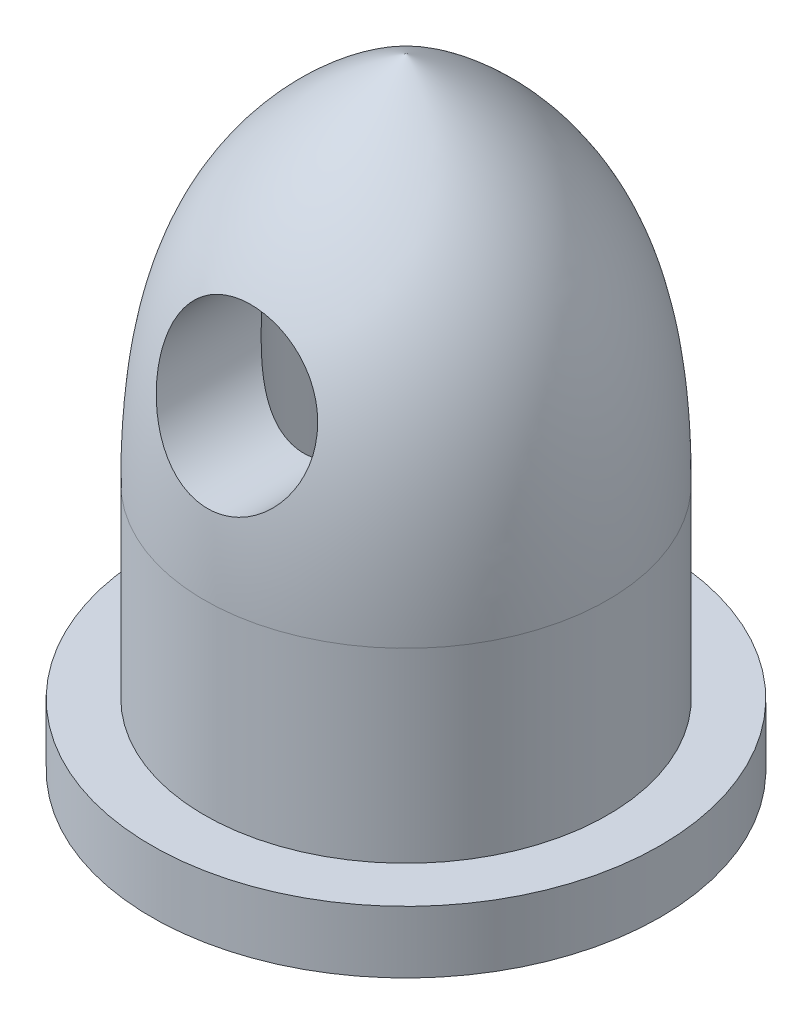
ISO-10303-21;
HEADER;
FILE_DESCRIPTION(('STEP AP214'),'2;1');
FILE_NAME('part.step','',(''),(''),'','','');
FILE_SCHEMA(('AUTOMOTIVE_DESIGN { 1 0 10303 214 1 1 1 1 }'));
ENDSEC;
DATA;
#1=APPLICATION_CONTEXT('core data for automotive mechanical design processes');
#2=APPLICATION_PROTOCOL_DEFINITION('international standard','automotive_design',2000,#1);
#3=PRODUCT_CONTEXT('',#1,'mechanical');
#4=PRODUCT('Part','Part','',(#3));
#5=PRODUCT_RELATED_PRODUCT_CATEGORY('part','',(#4));
#6=PRODUCT_DEFINITION_FORMATION('','',#4);
#7=PRODUCT_DEFINITION_CONTEXT('part definition',#1,'design');
#8=PRODUCT_DEFINITION('design','',#6,#7);
#9=PRODUCT_DEFINITION_SHAPE('','',#8);
#10=(LENGTH_UNIT() NAMED_UNIT(*) SI_UNIT(.MILLI.,.METRE.));
#11=(NAMED_UNIT(*) PLANE_ANGLE_UNIT() SI_UNIT($,.RADIAN.));
#12=(NAMED_UNIT(*) SI_UNIT($,.STERADIAN.) SOLID_ANGLE_UNIT());
#13=UNCERTAINTY_MEASURE_WITH_UNIT(LENGTH_MEASURE(1.E-05),#10,'distance_accuracy_value','');
#14=(GEOMETRIC_REPRESENTATION_CONTEXT(3) GLOBAL_UNCERTAINTY_ASSIGNED_CONTEXT((#13)) GLOBAL_UNIT_ASSIGNED_CONTEXT((#10,
#11,#12)) REPRESENTATION_CONTEXT('',''));
#15=CARTESIAN_POINT('',(0.,0.,0.));
#16=DIRECTION('',(0.,0.,1.));
#17=DIRECTION('',(1.,0.,0.));
#18=AXIS2_PLACEMENT_3D('',#15,#16,#17);
#19=CARTESIAN_POINT('',(0.,10.,0.));
#20=CARTESIAN_POINT('',(-2.59452358270877,8.6911225465027,0.));
#21=CARTESIAN_POINT('',(-3.25,6.80967390506826,0.));
#22=CARTESIAN_POINT('',(-3.25,4.,0.));
#23=B_SPLINE_CURVE_WITH_KNOTS('',3,(#19,#20,#21,#22),.UNSPECIFIED.,.F.,.F.,(4,4),(0.,1.),.UNSPECIFIED.);
#24=CARTESIAN_POINT('',(0.,10.,0.));
#25=DIRECTION('',(0.,1.,0.));
#26=AXIS1_PLACEMENT('',#24,#25);
#27=SURFACE_OF_REVOLUTION('',#23,#26);
#28=CARTESIAN_POINT('',(1.25,6.5,-2.71336056488375));
#29=CARTESIAN_POINT('',(1.24999706890003,6.42605930952014,-2.73432925302387));
#30=CARTESIAN_POINT('',(1.24342030669724,6.3524448570672,-2.75664098981164));
#31=CARTESIAN_POINT('',(1.21763100289867,6.20797978929061,-2.80305741192993));
#32=CARTESIAN_POINT('',(1.19839924334458,6.13713355141781,-2.82716477465352));
#33=CARTESIAN_POINT('',(1.14804531713542,6.00019736549401,-2.87603225819439));
#34=CARTESIAN_POINT('',(1.11694391819691,5.93409934838128,-2.90079116898173));
#35=CARTESIAN_POINT('',(1.04364132016693,5.80817594900502,-2.94979704568391));
#36=CARTESIAN_POINT('',(1.00144184728995,5.74834959325822,-2.97404409058223));
#37=CARTESIAN_POINT('',(0.906082819901378,5.63568292311097,-3.02109594984765));
#38=CARTESIAN_POINT('',(0.852762418087321,5.58296627855499,-3.04387233280013));
#39=CARTESIAN_POINT('',(0.736746052300377,5.4874060822741,-3.0861066315173));
#40=CARTESIAN_POINT('',(0.674052696457813,5.44455979241206,-3.10556546721318));
#41=CARTESIAN_POINT('',(0.544650860192337,5.37260264065534,-3.13875378952327));
#42=CARTESIAN_POINT('',(0.478363442248877,5.34285727736281,-3.15274297100791));
#43=CARTESIAN_POINT('',(0.340822181710832,5.29516581103254,-3.17536262003939));
#44=CARTESIAN_POINT('',(0.269572442416748,5.27721008441432,-3.18399745787977));
#45=CARTESIAN_POINT('',(0.131495755858973,5.25516102375482,-3.19462739280441));
#46=CARTESIAN_POINT('',(0.0648948555072831,5.24990917503875,-3.19717707598393));
#47=CARTESIAN_POINT('',(-0.0682796010582935,5.25009311580612,-3.19708774830641));
#48=CARTESIAN_POINT('',(-0.134853159565741,5.25552577366751,-3.19445025780669));
#49=CARTESIAN_POINT('',(-0.262794242463718,5.27629960365815,-3.18443768766642));
#50=CARTESIAN_POINT('',(-0.324259133150491,5.29116057366445,-3.17729229774781));
#51=CARTESIAN_POINT('',(-0.443704730884242,5.32971532198573,-3.15895719124495));
#52=CARTESIAN_POINT('',(-0.501684999136251,5.35341021000154,-3.14776696656125));
#53=CARTESIAN_POINT('',(-0.614943101480825,5.40981820247614,-3.12152840216628));
#54=CARTESIAN_POINT('',(-0.670039297228414,5.44283489547766,-3.10635165042093));
#55=CARTESIAN_POINT('',(-0.774076279593557,5.51644703911188,-3.07319583682087));
#56=CARTESIAN_POINT('',(-0.823006645830806,5.55705503909688,-3.05521214299535));
#57=CARTESIAN_POINT('',(-0.917794154330441,5.64860855961699,-3.0156726327901));
#58=CARTESIAN_POINT('',(-0.963004052409346,5.70014873399713,-2.99394180970838));
#59=CARTESIAN_POINT('',(-1.04425286348827,5.80957623190649,-2.94931936640465));
#60=CARTESIAN_POINT('',(-1.08028758727132,5.86746643754625,-2.92642722164442));
#61=CARTESIAN_POINT('',(-1.14483239410898,5.99285513121694,-2.87878291045695));
#62=CARTESIAN_POINT('',(-1.17257050499709,6.06074895176305,-2.85402061332667));
#63=CARTESIAN_POINT('',(-1.21580889111507,6.20057393883875,-2.80556824259504));
#64=CARTESIAN_POINT('',(-1.23132700784243,6.27249905448875,-2.78187665358493));
#65=CARTESIAN_POINT('',(-1.249593844381,6.41922823875765,-2.73636447904622));
#66=CARTESIAN_POINT('',(-1.25223425654213,6.49405140910258,-2.71456127287666));
#67=CARTESIAN_POINT('',(-1.24396471881445,6.64375526343776,-2.67390939005859));
#68=CARTESIAN_POINT('',(-1.2330594757932,6.71863591841931,-2.65505968968335));
#69=CARTESIAN_POINT('',(-1.19851401118997,6.86228097592208,-2.62170976934676));
#70=CARTESIAN_POINT('',(-1.17553302688534,6.93116445438953,-2.60704005323732));
#71=CARTESIAN_POINT('',(-1.11767884859503,7.06441542513494,-2.58102141859354));
#72=CARTESIAN_POINT('',(-1.08280898374841,7.12878417555535,-2.56967157207643));
#73=CARTESIAN_POINT('',(-1.00400049967121,7.24789215456721,-2.55059470288105));
#74=CARTESIAN_POINT('',(-0.960564903983828,7.30294171184013,-2.54272252804102));
#75=CARTESIAN_POINT('',(-0.864921933993143,7.40515600332737,-2.52948711913316));
#76=CARTESIAN_POINT('',(-0.812715184004766,7.45232129825291,-2.52412370659891));
#77=CARTESIAN_POINT('',(-0.701740173669762,7.53675530211712,-2.51546023535634));
#78=CARTESIAN_POINT('',(-0.643063292561546,7.57414167951566,-2.51213492813866));
#79=CARTESIAN_POINT('',(-0.520275772271923,7.63869410748685,-2.50692116625865));
#80=CARTESIAN_POINT('',(-0.456165011142032,7.6658599286128,-2.50503274385275));
#81=CARTESIAN_POINT('',(-0.323908369704576,7.70932126406438,-2.5022274644409));
#82=CARTESIAN_POINT('',(-0.255740410675904,7.72554997449244,-2.50131655845172));
#83=CARTESIAN_POINT('',(-0.117646300531253,7.74640924117252,-2.50017588031903));
#84=CARTESIAN_POINT('',(-0.0477201009084118,7.75103947708703,-2.49994612698819));
#85=CARTESIAN_POINT('',(0.0922435475045982,7.74856404382778,-2.50007441208017));
#86=CARTESIAN_POINT('',(0.162280054003221,7.741404861857,-2.50043513064205));
#87=CARTESIAN_POINT('',(0.300157336950403,7.71545322510053,-2.50189444803002));
#88=CARTESIAN_POINT('',(0.36799807406936,7.69666056206254,-2.50299306006525));
#89=CARTESIAN_POINT('',(0.499549199404022,7.64798476896275,-2.50628412148433));
#90=CARTESIAN_POINT('',(0.563259659030177,7.61810183070641,-2.5084765519509));
#91=CARTESIAN_POINT('',(0.684718913016792,7.54812749321741,-2.5144504751758));
#92=CARTESIAN_POINT('',(0.742468153061548,7.50803685793047,-2.5182318490311));
#93=CARTESIAN_POINT('',(0.850079739286846,7.41908309904465,-2.52789674581988));
#94=CARTESIAN_POINT('',(0.899979399557259,7.37026399191378,-2.53376986139795));
#95=CARTESIAN_POINT('',(0.990832722386541,7.26522661318371,-2.54808927060641));
#96=CARTESIAN_POINT('',(1.03178552598185,7.20900763197216,-2.55653581111812));
#97=CARTESIAN_POINT('',(1.10345490082896,7.0912801980923,-2.57625367959931));
#98=CARTESIAN_POINT('',(1.13422674633325,7.02980266725389,-2.58750915197481));
#99=CARTESIAN_POINT('',(1.18514338432863,6.90321512758577,-2.61294540896401));
#100=CARTESIAN_POINT('',(1.20529726103367,6.83810827674027,-2.62712367847732));
#101=CARTESIAN_POINT('',(1.23003742056349,6.727227165467,-2.65326046718336));
#102=CARTESIAN_POINT('',(1.2375381182527,6.68190486345074,-2.66448622385577));
#103=CARTESIAN_POINT('',(1.24752029464769,6.59101396050689,-2.68809239778215));
#104=CARTESIAN_POINT('',(1.25000180151004,6.54544536096243,-2.70047280855834));
#105=CARTESIAN_POINT('',(1.25,6.5,-2.71336056488375));
#106=B_SPLINE_CURVE_WITH_KNOTS('',3,(#28,#29,#30,#31,#32,#33,#34,#35,#36,#37,#38,#39,#40,#41,
#42,#43,#44,#45,#46,#47,#48,#49,#50,#51,#52,#53,#54,#55,#56,#57,#58,#59,#60,#61,#62,#63,#64,#65,
#66,#67,#68,#69,#70,#71,#72,#73,#74,#75,#76,#77,#78,#79,#80,#81,#82,#83,#84,#85,#86,#87,#88,#89,
#90,#91,#92,#93,#94,#95,#96,#97,#98,#99,#100,#101,#102,#103,#104,#105),.UNSPECIFIED.,.T.,.F.,(4,
2,2,2,2,2,2,2,2,2,2,2,2,2,2,2,2,2,2,2,2,2,2,2,2,2,2,2,2,2,2,2,2,2,2,2,2,2,4),(0.,
0.230390407086859,0.461131496442814,0.691470706849195,0.921774111046018,1.15567358467619,
1.38950809385841,1.61025615330209,1.8308237969658,2.03036069128348,2.22983911018056,
2.41989416294065,2.60997309812163,2.80714657959342,3.00464894232402,3.2194957158518,
3.43444040929608,3.6655878036744,3.89639708809738,4.12914428053563,4.36181062019938,
4.58292401813479,4.80397555040504,5.01464187626912,5.22529321363229,5.43327922691797,
5.64126990911385,5.85051975590472,6.05977538188994,6.26998345092414,6.48019528302649,
6.69040347970065,6.90059594898055,7.10975689971375,7.31893792260905,7.52696387932005,
7.73481156900222,7.87641470903654,8.01801705470568),.UNSPECIFIED.);
#107=CARTESIAN_POINT('',(1.25,6.5,-2.71336056488375));
#108=VERTEX_POINT('',#107);
#109=EDGE_CURVE('E74',#108,#108,#106,.T.);
#110=ORIENTED_EDGE('',*,*,#109,.F.);
#111=EDGE_LOOP('',(#110));
#112=FACE_BOUND('',#111,.T.);
#113=CARTESIAN_POINT('',(1.25,6.5,2.71336056488375));
#114=CARTESIAN_POINT('',(1.24999846936145,6.56883200814017,2.69384338747694));
#115=CARTESIAN_POINT('',(1.244301669662,6.63801061499252,2.67547203833074));
#116=CARTESIAN_POINT('',(1.22132144391168,6.77515117211635,2.6415481277417));
#117=CARTESIAN_POINT('',(1.20403566815672,6.84311287278638,2.6259961387462));
#118=CARTESIAN_POINT('',(1.15801990037752,6.975845915449,2.59796186373143));
#119=CARTESIAN_POINT('',(1.12927320867849,7.04061244633266,2.58548410027516));
#120=CARTESIAN_POINT('',(1.06096286851784,7.16473643535575,2.5636171552985));
#121=CARTESIAN_POINT('',(1.02140047202903,7.22409451849085,2.55422761657738));
#122=CARTESIAN_POINT('',(0.933682049816591,7.33399906840884,2.53846260694371));
#123=CARTESIAN_POINT('',(0.885773480948401,7.38473304293388,2.53201576426096));
#124=CARTESIAN_POINT('',(0.782047537377301,7.47762381085118,2.52134844873033));
#125=CARTESIAN_POINT('',(0.726230271289888,7.51978072201871,2.51712794531039));
#126=CARTESIAN_POINT('',(0.60857922488931,7.59405080492727,2.51040649332948));
#127=CARTESIAN_POINT('',(0.546777174020909,7.62621350925142,2.50789698838531));
#128=CARTESIAN_POINT('',(0.418662659047247,7.67984935388632,2.50406285630008));
#129=CARTESIAN_POINT('',(0.352350077917435,7.70132221673153,2.50273825991382));
#130=CARTESIAN_POINT('',(0.216602295893918,7.73307574276658,2.50087951850537));
#131=CARTESIAN_POINT('',(0.147148690524509,7.74327807655591,2.50035089635654));
#132=CARTESIAN_POINT('',(0.00751042720964628,7.75193344900961,2.49989824596122));
#133=CARTESIAN_POINT('',(-0.0626742489110376,7.75038619486664,2.49997423278199));
#134=CARTESIAN_POINT('',(-0.202017518782376,7.7355619776333,2.5007635684269));
#135=CARTESIAN_POINT('',(-0.271172133817776,7.72224768166712,2.50147894590481));
#136=CARTESIAN_POINT('',(-0.406258609933776,7.68422018377787,2.503812470126));
#137=CARTESIAN_POINT('',(-0.47219044885156,7.65950690347693,2.50543062307666));
#138=CARTESIAN_POINT('',(-0.598874909461123,7.59943510657561,2.5100077711881));
#139=CARTESIAN_POINT('',(-0.659633134593527,7.56408830005225,2.51296529318195));
#140=CARTESIAN_POINT('',(-0.774300695229632,7.48379689492175,2.52074992641837));
#141=CARTESIAN_POINT('',(-0.828210493052519,7.43885294474208,2.52557691136929));
#142=CARTESIAN_POINT('',(-0.927333583935125,7.34105300160447,2.53757895590983));
#143=CARTESIAN_POINT('',(-0.972598141116346,7.28824717758661,2.54473944631718));
#144=CARTESIAN_POINT('',(-1.05359772040989,7.17617432281094,2.56180781355123));
#145=CARTESIAN_POINT('',(-1.08933341745943,7.11690775009258,2.57171549569056));
#146=CARTESIAN_POINT('',(-1.15029979252366,6.99396718892513,2.59443642861204));
#147=CARTESIAN_POINT('',(-1.17556421636165,6.93030814216874,2.60724013685891));
#148=CARTESIAN_POINT('',(-1.21528780970449,6.80032623290943,2.6357219811735));
#149=CARTESIAN_POINT('',(-1.22974603435227,6.7340031380054,2.6514003684441));
#150=CARTESIAN_POINT('',(-1.24795948776251,6.59912962275011,2.68569869382736));
#151=CARTESIAN_POINT('',(-1.25147990511193,6.53056186522211,2.70437422968638));
#152=CARTESIAN_POINT('',(-1.24739332958381,6.39438775856477,2.74387249714363));
#153=CARTESIAN_POINT('',(-1.23978350062348,6.32678165890676,2.76469577474821));
#154=CARTESIAN_POINT('',(-1.21323181045252,6.19080015570643,2.80884675873358));
#155=CARTESIAN_POINT('',(-1.19374191914919,6.12255555912573,2.83224764641183));
#156=CARTESIAN_POINT('',(-1.1435865808729,5.99037312727144,2.87968210777059));
#157=CARTESIAN_POINT('',(-1.11289781916161,5.92644460901151,2.90371690361832));
#158=CARTESIAN_POINT('',(-1.03945398475744,5.80178824066727,2.95234398239835));
#159=CARTESIAN_POINT('',(-0.996219207375008,5.74133278541621,2.97691287714318));
#160=CARTESIAN_POINT('',(-0.899371092267267,5.62871707820259,3.02407531547221));
#161=CARTESIAN_POINT('',(-0.845779988322621,5.57653948402185,3.04667294291862));
#162=CARTESIAN_POINT('',(-0.730309429187859,5.48285654098307,3.0881618517426));
#163=CARTESIAN_POINT('',(-0.668584258103946,5.44118670081946,3.10710899672947));
#164=CARTESIAN_POINT('',(-0.537743947100444,5.36911645341545,3.14037481691905));
#165=CARTESIAN_POINT('',(-0.468634236476468,5.33870783911003,3.15469686186877));
#166=CARTESIAN_POINT('',(-0.331406348506657,5.29275306492721,3.17652268643251));
#167=CARTESIAN_POINT('',(-0.263719677186682,5.27614867216069,3.18450915514289));
#168=CARTESIAN_POINT('',(-0.126122442728343,5.25443375873502,3.1949780308356));
#169=CARTESIAN_POINT('',(-0.0562132142207106,5.24931646758736,3.19746367998436));
#170=CARTESIAN_POINT('',(0.0778261885454029,5.25077088206751,3.19675991856456));
#171=CARTESIAN_POINT('',(0.141970804178781,5.25643928695764,3.19400905692719));
#172=CARTESIAN_POINT('',(0.268269687676827,5.27744986011403,3.18388423372709));
#173=CARTESIAN_POINT('',(0.330424025809287,5.29279168645852,3.17651043556912));
#174=CARTESIAN_POINT('',(0.450955845623309,5.33245664106129,3.15766036439332));
#175=CARTESIAN_POINT('',(0.509341553826615,5.35675937176543,3.14619341043379));
#176=CARTESIAN_POINT('',(0.621189358309068,5.41346488656162,3.1198501254905));
#177=CARTESIAN_POINT('',(0.674650275918953,5.4458696028765,3.10497298128929));
#178=CARTESIAN_POINT('',(0.7792481267101,5.52036567582335,3.07144423355418));
#179=CARTESIAN_POINT('',(0.829947942458341,5.5629827702631,3.05259920194248));
#180=CARTESIAN_POINT('',(0.923648027630875,5.65519199163068,3.01289257921245));
#181=CARTESIAN_POINT('',(0.96664351009975,5.70478842112104,2.99202974667671));
#182=CARTESIAN_POINT('',(1.04769709410441,5.81451367425407,2.94732884681197));
#183=CARTESIAN_POINT('',(1.08496258979197,5.87518867952568,2.92339199595096));
#184=CARTESIAN_POINT('',(1.14867504424666,6.00192979471027,2.87545410325329));
#185=CARTESIAN_POINT('',(1.17512518247939,6.06799431337019,2.85145308237254));
#186=CARTESIAN_POINT('',(1.21364780021642,6.19453694646197,2.80771342657904));
#187=CARTESIAN_POINT('',(1.22720383010245,6.25452220054809,2.78784471556505));
#188=CARTESIAN_POINT('',(1.24537924213185,6.37624487557513,2.74946106746736));
#189=CARTESIAN_POINT('',(1.2500013791189,6.43798175042838,2.73094571475884));
#190=CARTESIAN_POINT('',(1.25,6.5,2.71336056488375));
#191=B_SPLINE_CURVE_WITH_KNOTS('',3,(#113,#114,#115,#116,#117,#118,#119,#120,#121,#122,#123,
#124,#125,#126,#127,#128,#129,#130,#131,#132,#133,#134,#135,#136,#137,#138,#139,#140,#141,#142,
#143,#144,#145,#146,#147,#148,#149,#150,#151,#152,#153,#154,#155,#156,#157,#158,#159,#160,#161,
#162,#163,#164,#165,#166,#167,#168,#169,#170,#171,#172,#173,#174,#175,#176,#177,#178,#179,#180,
#181,#182,#183,#184,#185,#186,#187,#188,#189,#190),.UNSPECIFIED.,.T.,.F.,(4,2,2,2,2,2,2,2,2,2,2,
2,2,2,2,2,2,2,2,2,2,2,2,2,2,2,2,2,2,2,2,2,2,2,2,2,2,2,4),(0.,0.21442150593217,0.428886499703063,
0.64366513876134,0.858418926619666,1.06764404556582,1.27686629136009,1.48503442703693,
1.69320796564428,1.90281936756487,2.11243599315479,2.32272005897768,2.5330055707067,
2.74306034984662,2.95310094120081,3.16185449838546,3.37059326544917,3.57865399788677,
3.78673292031504,3.99924903508143,4.21181931022238,4.43502720970923,4.65870247806252,
4.89241586965706,5.12563297194319,5.35493400914449,5.58406760370852,5.79337743288723,
6.00256386259217,6.19499744837565,6.38742423268288,6.57941567636841,6.77145295137438,
6.97717550609051,7.18302544308842,7.40740151970156,7.63171158741862,7.82496686670089,
8.01816254452196),.UNSPECIFIED.);
#192=CARTESIAN_POINT('',(1.25,6.5,2.71336056488375));
#193=VERTEX_POINT('',#192);
#194=EDGE_CURVE('E101',#193,#193,#191,.T.);
#195=ORIENTED_EDGE('',*,*,#194,.F.);
#196=EDGE_LOOP('',(#195));
#197=FACE_BOUND('',#196,.T.);
#198=CARTESIAN_POINT('',(0.,4.,0.));
#199=DIRECTION('',(0.,1.,0.));
#200=DIRECTION('',(-1.,0.,0.));
#201=AXIS2_PLACEMENT_3D('',#198,#199,#200);
#202=CIRCLE('',#201,3.25);
#203=CARTESIAN_POINT('',(-3.25,4.,0.));
#204=VERTEX_POINT('',#203);
#205=EDGE_CURVE('E11',#204,#204,#202,.T.);
#206=ORIENTED_EDGE('',*,*,#205,.T.);
#207=EDGE_LOOP('',(#206));
#208=FACE_BOUND('',#207,.T.);
#209=CARTESIAN_POINT('',(0.,10.,0.));
#210=VERTEX_POINT('',#209);
#211=VERTEX_LOOP('',#210);
#212=FACE_BOUND('',#211,.T.);
#213=ADVANCED_FACE('F36',(#112,#197,#208,#212),#27,.F.);
#214=CARTESIAN_POINT('',(0.,10.,0.));
#215=DIRECTION('',(0.,1.,0.));
#216=DIRECTION('',(-1.,0.,0.));
#217=AXIS2_PLACEMENT_3D('',#214,#215,#216);
#218=CYLINDRICAL_SURFACE('',#217,3.25);
#219=CARTESIAN_POINT('',(0.,0.999999999999999,0.));
#220=DIRECTION('',(0.,1.,0.));
#221=DIRECTION('',(-1.,0.,0.));
#222=AXIS2_PLACEMENT_3D('',#219,#220,#221);
#223=CIRCLE('',#222,3.25);
#224=CARTESIAN_POINT('',(-3.25,0.999999999999999,0.));
#225=VERTEX_POINT('',#224);
#226=EDGE_CURVE('E50',#225,#225,#223,.T.);
#227=ORIENTED_EDGE('',*,*,#226,.T.);
#228=EDGE_LOOP('',(#227));
#229=FACE_BOUND('',#228,.T.);
#230=ORIENTED_EDGE('',*,*,#205,.F.);
#231=EDGE_LOOP('',(#230));
#232=FACE_BOUND('',#231,.T.);
#233=ADVANCED_FACE('F113',(#229,#232),#218,.T.);
#234=CARTESIAN_POINT('',(-3.25,1.,0.));
#235=DIRECTION('',(0.,1.,0.));
#236=DIRECTION('',(-1.,0.,0.));
#237=AXIS2_PLACEMENT_3D('',#234,#235,#236);
#238=PLANE('',#237);
#239=CARTESIAN_POINT('',(0.,0.999999999999999,0.));
#240=DIRECTION('',(0.,1.,0.));
#241=DIRECTION('',(-1.,0.,0.));
#242=AXIS2_PLACEMENT_3D('',#239,#240,#241);
#243=CIRCLE('',#242,4.1);
#244=CARTESIAN_POINT('',(-4.1,0.999999999999999,0.));
#245=VERTEX_POINT('',#244);
#246=EDGE_CURVE('E71',#245,#245,#243,.T.);
#247=ORIENTED_EDGE('',*,*,#246,.T.);
#248=EDGE_LOOP('',(#247));
#249=FACE_BOUND('',#248,.T.);
#250=ORIENTED_EDGE('',*,*,#226,.F.);
#251=EDGE_LOOP('',(#250));
#252=FACE_BOUND('',#251,.T.);
#253=ADVANCED_FACE('F119',(#249,#252),#238,.T.);
#254=CARTESIAN_POINT('',(0.,10.,0.));
#255=DIRECTION('',(0.,1.,0.));
#256=DIRECTION('',(-1.,0.,0.));
#257=AXIS2_PLACEMENT_3D('',#254,#255,#256);
#258=CYLINDRICAL_SURFACE('',#257,4.1);
#259=CARTESIAN_POINT('',(0.,0.,0.));
#260=DIRECTION('',(0.,1.,0.));
#261=DIRECTION('',(-1.,0.,0.));
#262=AXIS2_PLACEMENT_3D('',#259,#260,#261);
#263=CIRCLE('',#262,4.1);
#264=CARTESIAN_POINT('',(-4.1,0.,0.));
#265=VERTEX_POINT('',#264);
#266=EDGE_CURVE('E67',#265,#265,#263,.T.);
#267=ORIENTED_EDGE('',*,*,#266,.T.);
#268=EDGE_LOOP('',(#267));
#269=FACE_BOUND('',#268,.T.);
#270=ORIENTED_EDGE('',*,*,#246,.F.);
#271=EDGE_LOOP('',(#270));
#272=FACE_BOUND('',#271,.T.);
#273=ADVANCED_FACE('F124',(#269,#272),#258,.T.);
#274=CARTESIAN_POINT('',(0.,0.,0.));
#275=DIRECTION('',(0.,-1.,0.));
#276=DIRECTION('',(1.,0.,0.));
#277=AXIS2_PLACEMENT_3D('',#274,#275,#276);
#278=PLANE('',#277);
#279=CARTESIAN_POINT('',(0.,0.,0.));
#280=DIRECTION('',(0.,-1.,0.));
#281=DIRECTION('',(0.,0.,-1.));
#282=AXIS2_PLACEMENT_3D('',#279,#280,#281);
#283=CIRCLE('',#282,1.64999999999999);
#284=CARTESIAN_POINT('',(0.,0.,-1.64999999999999));
#285=VERTEX_POINT('',#284);
#286=EDGE_CURVE('E68',#285,#285,#283,.T.);
#287=ORIENTED_EDGE('',*,*,#286,.F.);
#288=EDGE_LOOP('',(#287));
#289=FACE_BOUND('',#288,.T.);
#290=ORIENTED_EDGE('',*,*,#266,.F.);
#291=EDGE_LOOP('',(#290));
#292=FACE_BOUND('',#291,.T.);
#293=ADVANCED_FACE('F61',(#289,#292),#278,.T.);
#294=CARTESIAN_POINT('',(0.,8.5,0.));
#295=DIRECTION('',(0.,-1.,0.));
#296=DIRECTION('',(0.,0.,-1.));
#297=AXIS2_PLACEMENT_3D('',#294,#295,#296);
#298=CONICAL_SURFACE('',#297,1.65,1.02974425867665);
#299=CARTESIAN_POINT('',(0.,9.49142002139548,0.));
#300=VERTEX_POINT('',#299);
#301=VERTEX_LOOP('',#300);
#302=FACE_BOUND('',#301,.T.);
#303=CARTESIAN_POINT('',(0.,8.5,0.));
#304=DIRECTION('',(0.,-1.,0.));
#305=DIRECTION('',(0.,0.,-1.));
#306=AXIS2_PLACEMENT_3D('',#303,#304,#305);
#307=CIRCLE('',#306,1.65);
#308=CARTESIAN_POINT('',(0.,8.5,-1.65));
#309=VERTEX_POINT('',#308);
#310=EDGE_CURVE('E65',#309,#309,#307,.T.);
#311=ORIENTED_EDGE('',*,*,#310,.T.);
#312=EDGE_LOOP('',(#311));
#313=FACE_BOUND('',#312,.T.);
#314=ADVANCED_FACE('F57',(#302,#313),#298,.F.);
#315=CARTESIAN_POINT('',(0.,0.,0.));
#316=DIRECTION('',(0.,-1.,0.));
#317=DIRECTION('',(0.,0.,-1.));
#318=AXIS2_PLACEMENT_3D('',#315,#316,#317);
#319=CYLINDRICAL_SURFACE('',#318,1.64999999999999);
#320=CARTESIAN_POINT('',(0.,7.75,-1.64999999999999));
#321=CARTESIAN_POINT('',(0.0608829633974074,7.7499952332996,-1.64999541347067));
#322=CARTESIAN_POINT('',(0.121849036421177,7.74551653855051,-1.6465954545185));
#323=CARTESIAN_POINT('',(0.241845849828209,7.727887208327,-1.6333018155673));
#324=CARTESIAN_POINT('',(0.300872162980126,7.71471801012176,-1.62339423563988));
#325=CARTESIAN_POINT('',(0.414944201570301,7.68061224777241,-1.59803511132106));
#326=CARTESIAN_POINT('',(0.470011455176492,7.65972220463486,-1.58261678920382));
#327=CARTESIAN_POINT('',(0.575486110741052,7.61116635227754,-1.54738877600454));
#328=CARTESIAN_POINT('',(0.625894395393844,7.58350183019925,-1.52757991918566));
#329=CARTESIAN_POINT('',(0.725971430987316,7.51946918140192,-1.48281580667678));
#330=CARTESIAN_POINT('',(0.775134839812224,7.48253068455901,-1.45755317834865));
#331=CARTESIAN_POINT('',(0.866975157755564,7.40253556672796,-1.40487145320663));
#332=CARTESIAN_POINT('',(0.909642118963894,7.3594697543028,-1.37744914481193));
#333=CARTESIAN_POINT('',(0.996394589815697,7.25830160788269,-1.3164551768397));
#334=CARTESIAN_POINT('',(1.03894132640253,7.19893276115347,-1.28278695853505));
#335=CARTESIAN_POINT('',(1.11363168831071,7.07245602252276,-1.21849860041975));
#336=CARTESIAN_POINT('',(1.14578875767428,7.00535828550263,-1.18787455733579));
#337=CARTESIAN_POINT('',(1.18916834378205,6.8883274008683,-1.14410622291948));
#338=CARTESIAN_POINT('',(1.2037815204251,6.8405511503274,-1.1285882399067));
#339=CARTESIAN_POINT('',(1.22733317333639,6.74227076591183,-1.10293172096463));
#340=CARTESIAN_POINT('',(1.23628481502273,6.69177325932462,-1.09278071368203));
#341=CARTESIAN_POINT('',(1.24794370445192,6.58859928395236,-1.07945518963457));
#342=CARTESIAN_POINT('',(1.25059026486484,6.53590656679153,-1.07634848899382));
#343=CARTESIAN_POINT('',(1.24918701251135,6.43072332849999,-1.07797589768294));
#344=CARTESIAN_POINT('',(1.24513545190748,6.37823286372862,-1.08271205356318));
#345=CARTESIAN_POINT('',(1.23156157310537,6.28117281792649,-1.098107859083));
#346=CARTESIAN_POINT('',(1.22271471961543,6.23638188154593,-1.10803161656113));
#347=CARTESIAN_POINT('',(1.20057163787403,6.14905873597814,-1.13198696434283));
#348=CARTESIAN_POINT('',(1.18727093536223,6.10652884818645,-1.14602268367171));
#349=CARTESIAN_POINT('',(1.14690386500373,5.99769106616164,-1.18674613567693));
#350=CARTESIAN_POINT('',(1.1164682146843,5.93351711512155,-1.21579394288336));
#351=CARTESIAN_POINT('',(1.04607644886704,5.81213020761418,-1.27687543773362));
#352=CARTESIAN_POINT('',(1.00609673788801,5.75493504270472,-1.30891640384225));
#353=CARTESIAN_POINT('',(0.915890316724118,5.64632506611766,-1.37361380180025));
#354=CARTESIAN_POINT('',(0.865408476755913,5.5951164497152,-1.40626241153638));
#355=CARTESIAN_POINT('',(0.755308720390276,5.501393118937,-1.46832900367157));
#356=CARTESIAN_POINT('',(0.695708198631583,5.45886220419816,-1.49775295771658));
#357=CARTESIAN_POINT('',(0.580411278707793,5.3913177052297,-1.54555082850307));
#358=CARTESIAN_POINT('',(0.52620240137964,5.36450635793614,-1.5649610180666));
#359=CARTESIAN_POINT('',(0.413055082745091,5.31864332594816,-1.59854896115489));
#360=CARTESIAN_POINT('',(0.354119524759308,5.29958695309937,-1.612729875472));
#361=CARTESIAN_POINT('',(0.232505470626446,5.27021321474634,-1.63471084210286));
#362=CARTESIAN_POINT('',(0.169805206965811,5.25995324200773,-1.64246897740448));
#363=CARTESIAN_POINT('',(0.043103858213554,5.24912930922627,-1.65065563879744));
#364=CARTESIAN_POINT('',(-0.0208965619073624,5.24856051166328,-1.65108782176587));
#365=CARTESIAN_POINT('',(-0.141051903199908,5.2566815970652,-1.64494258378824));
#366=CARTESIAN_POINT('',(-0.197316108436389,5.2643913252608,-1.63910720520878));
#367=CARTESIAN_POINT('',(-0.307494178980643,5.28710574964073,-1.62205310583213));
#368=CARTESIAN_POINT('',(-0.361407579738607,5.30211188063456,-1.61083332621888));
#369=CARTESIAN_POINT('',(-0.46720171948927,5.33920007793286,-1.58344423703829));
#370=CARTESIAN_POINT('',(-0.518981011038017,5.36147128489898,-1.56714321108117));
#371=CARTESIAN_POINT('',(-0.618035571875301,5.41205318379883,-1.53079050213831));
#372=CARTESIAN_POINT('',(-0.665310176752948,5.44036476465849,-1.510738267163));
#373=CARTESIAN_POINT('',(-0.762350769202285,5.5073522082347,-1.46446772903231));
#374=CARTESIAN_POINT('',(-0.811241317689558,5.5469673530155,-1.4377779283806));
#375=CARTESIAN_POINT('',(-0.902129682904117,5.63249430880088,-1.38256953995618));
#376=CARTESIAN_POINT('',(-0.944112910603405,5.67841908058301,-1.35404725394398));
#377=CARTESIAN_POINT('',(-1.02846635425442,5.78564946970837,-1.29151812243483));
#378=CARTESIAN_POINT('',(-1.06928106369951,5.84820241244753,-1.25753860089227));
#379=CARTESIAN_POINT('',(-1.13978768847517,5.98132103554711,-1.19399465395394));
#380=CARTESIAN_POINT('',(-1.16950729396237,6.0518661876671,-1.16441934943596));
#381=CARTESIAN_POINT('',(-1.2071009970852,6.17183494153456,-1.12509800364926));
#382=CARTESIAN_POINT('',(-1.21898008884834,6.21892307638746,-1.11210244750915));
#383=CARTESIAN_POINT('',(-1.23724497687052,6.31528891554237,-1.09174836705623));
#384=CARTESIAN_POINT('',(-1.24364372564183,6.3645611660197,-1.08437655584393));
#385=CARTESIAN_POINT('',(-1.25050020099962,6.46442387422975,-1.0764672931875));
#386=CARTESIAN_POINT('',(-1.25091857898924,6.51502087018996,-1.07597510756785));
#387=CARTESIAN_POINT('',(-1.24567244922421,6.61549062774535,-1.08204093267923));
#388=CARTESIAN_POINT('',(-1.24000137990863,6.66536254930782,-1.08860654840999));
#389=CARTESIAN_POINT('',(-1.22154437316923,6.77152400337412,-1.10930056654893));
#390=CARTESIAN_POINT('',(-1.20768131862977,6.82739696749351,-1.1245572250085));
#391=CARTESIAN_POINT('',(-1.17317490763318,6.93518004959375,-1.16050811620953));
#392=CARTESIAN_POINT('',(-1.15251408233563,6.98707952846085,-1.18121633060671));
#393=CARTESIAN_POINT('',(-1.09615349189857,7.1055948063428,-1.23407688048978));
#394=CARTESIAN_POINT('',(-1.05772255586966,7.17030101763589,-1.26758641150612));
#395=CARTESIAN_POINT('',(-0.970332330506907,7.29154486327354,-1.33567950064935));
#396=CARTESIAN_POINT('',(-0.92136158591076,7.34807349708787,-1.37026419205051));
#397=CARTESIAN_POINT('',(-0.812570110684186,7.45289339062743,-1.43748965781388));
#398=CARTESIAN_POINT('',(-0.752617331109335,7.50106874522811,-1.47009953134266));
#399=CARTESIAN_POINT('',(-0.622902091955946,7.58650076844529,-1.52955819165171));
#400=CARTESIAN_POINT('',(-0.553163313137075,7.62378314442875,-1.55642050184046));
#401=CARTESIAN_POINT('',(-0.426797834397556,7.67626043806442,-1.59479520024996));
#402=CARTESIAN_POINT('',(-0.372183002299291,7.69472427813607,-1.60850028109709));
#403=CARTESIAN_POINT('',(-0.259949552383002,7.72403749756539,-1.63038973571176));
#404=CARTESIAN_POINT('',(-0.202338946592246,7.73490616741475,-1.6385880935828));
#405=CARTESIAN_POINT('',(-0.12020233410116,7.74444023164283,-1.64579138649073));
#406=CARTESIAN_POINT('',(-0.0962427455208096,7.74652159470469,-1.64736614453552));
#407=CARTESIAN_POINT('',(-0.0481931314523733,7.7493025732977,-1.64947147318422));
#408=CARTESIAN_POINT('',(-0.0241030786320857,7.75000188709859,-1.6500018157703));
#409=CARTESIAN_POINT('',(0.,7.75,-1.64999999999999));
#410=B_SPLINE_CURVE_WITH_KNOTS('',3,(#320,#321,#322,#323,#324,#325,#326,#327,#328,#329,#330,
#331,#332,#333,#334,#335,#336,#337,#338,#339,#340,#341,#342,#343,#344,#345,#346,#347,#348,#349,
#350,#351,#352,#353,#354,#355,#356,#357,#358,#359,#360,#361,#362,#363,#364,#365,#366,#367,#368,
#369,#370,#371,#372,#373,#374,#375,#376,#377,#378,#379,#380,#381,#382,#383,#384,#385,#386,#387,
#388,#389,#390,#391,#392,#393,#394,#395,#396,#397,#398,#399,#400,#401,#402,#403,#404,#405,#406,
#407,#408,#409),.UNSPECIFIED.,.T.,.F.,(4,2,2,2,2,2,2,2,2,2,2,2,2,2,2,2,2,2,2,2,2,2,2,2,2,2,2,2,
2,2,2,2,2,2,2,2,2,2,2,2,2,2,2,2,4),(0.,0.182544837100256,0.365480853652027,0.547332118891946,
0.729148859419209,0.927885054752803,1.12692257568281,1.36721199200182,1.60718922114581,
1.76361888123479,1.91968342686578,2.07724415295095,2.23484600012199,2.37450232940634,
2.51429937805256,2.74325380921193,2.97278024864591,3.20872076052624,3.44421668236898,
3.63400440217133,3.82367721758044,4.01457834901152,4.20538418599999,4.37585757576131,
4.54636450202388,4.72172170093675,4.89710472394846,5.10141880203103,5.30615902306531,
5.55126367740739,5.79575246621729,5.94603426155455,6.09595988556514,6.24687151326624,
6.39794591607553,6.57562616152413,6.75376662140644,6.99965448654953,7.24581095842497,
7.49514884123258,7.74389344499287,7.92096529432788,8.09758575930353,8.16983802897297,
8.24210607108171),.UNSPECIFIED.);
#411=CARTESIAN_POINT('',(0.,7.75,-1.64999999999999));
#412=VERTEX_POINT('',#411);
#413=EDGE_CURVE('E41',#412,#412,#410,.T.);
#414=ORIENTED_EDGE('',*,*,#413,.T.);
#415=EDGE_LOOP('',(#414));
#416=FACE_BOUND('',#415,.T.);
#417=CARTESIAN_POINT('',(1.25,6.5,1.07703296142689));
#418=CARTESIAN_POINT('',(1.24999214833483,6.55804444947862,1.0770493792956));
#419=CARTESIAN_POINT('',(1.24590450436831,6.61615010984882,1.08184203618685));
#420=CARTESIAN_POINT('',(1.2300143019573,6.73000921003106,1.09986049813824));
#421=CARTESIAN_POINT('',(1.21818411429,6.78575346177425,1.11311650043554));
#422=CARTESIAN_POINT('',(1.18465710463998,6.90452752144709,1.14882332081937));
#423=CARTESIAN_POINT('',(1.16143456638492,6.96670753358603,1.172602157441));
#424=CARTESIAN_POINT('',(1.10651577982521,7.08514856837617,1.22456309184684));
#425=CARTESIAN_POINT('',(1.07480831582571,7.14140161837278,1.25275099706407));
#426=CARTESIAN_POINT('',(1.00276392166928,7.24917223550718,1.3111707853611));
#427=CARTESIAN_POINT('',(0.962242874864475,7.30054865524435,1.34143501709616));
#428=CARTESIAN_POINT('',(0.873378132491653,7.39665360876356,1.40091716984465));
#429=CARTESIAN_POINT('',(0.82504118385997,7.44138781299344,1.43013596697767));
#430=CARTESIAN_POINT('',(0.722958214309579,7.52169800074395,1.48426001963046));
#431=CARTESIAN_POINT('',(0.669523115199799,7.55757884643991,1.50929460140506));
#432=CARTESIAN_POINT('',(0.556183707149913,7.62132977676977,1.55463144047775));
#433=CARTESIAN_POINT('',(0.496280746354462,7.64920152638179,1.57493468118877));
#434=CARTESIAN_POINT('',(0.370552344506219,7.69570798998144,1.60918224713362));
#435=CARTESIAN_POINT('',(0.304678277145486,7.7142569587618,1.62306745294531));
#436=CARTESIAN_POINT('',(0.169627053094858,7.74033761016003,1.6426689886209));
#437=CARTESIAN_POINT('',(0.100454242077556,7.74788339544631,1.64839577483092));
#438=CARTESIAN_POINT('',(-0.0276989885961317,7.75107947180413,1.65081844164027));
#439=CARTESIAN_POINT('',(-0.0866227366222072,7.74837036924067,1.64875989317071));
#440=CARTESIAN_POINT('',(-0.202970408996437,7.73480014646174,1.63850885308847));
#441=CARTESIAN_POINT('',(-0.260394302606777,7.72393885931192,1.63031623586695));
#442=CARTESIAN_POINT('',(-0.370453396784087,7.6951589043794,1.6088246765737));
#443=CARTESIAN_POINT('',(-0.423181472962336,7.67746703813314,1.59569014990876));
#444=CARTESIAN_POINT('',(-0.524784560506488,7.63583372063104,1.56522117445543));
#445=CARTESIAN_POINT('',(-0.573658900084177,7.61189118287245,1.54788599553993));
#446=CARTESIAN_POINT('',(-0.673132665242871,7.5550332599328,1.50752803171698));
#447=CARTESIAN_POINT('',(-0.723108779725613,7.5213507675844,1.48405658710095));
#448=CARTESIAN_POINT('',(-0.816994689997691,7.44793370033146,1.43451863292472));
#449=CARTESIAN_POINT('',(-0.86089720776883,7.40819198241639,1.40844907326705));
#450=CARTESIAN_POINT('',(-0.950690392870626,7.31468226190857,1.34985590060899));
#451=CARTESIAN_POINT('',(-0.995171228170664,7.25970520804198,1.31709752409521));
#452=CARTESIAN_POINT('',(-1.07462525832274,7.14241550872607,1.25310529061143));
#453=CARTESIAN_POINT('',(-1.10960059267203,7.0801045185308,1.22187109188034));
#454=CARTESIAN_POINT('',(-1.16077129211808,6.96671138095954,1.17302745517809));
#455=CARTESIAN_POINT('',(-1.17948330067698,6.91736084078877,1.15405029693823));
#456=CARTESIAN_POINT('',(-1.21078580521653,6.81517834637321,1.1211669659777));
#457=CARTESIAN_POINT('',(-1.22339088725661,6.76235503314395,1.10724873037524));
#458=CARTESIAN_POINT('',(-1.24025676077946,6.66251402167052,1.08830212597375));
#459=CARTESIAN_POINT('',(-1.24550951278129,6.61586895469848,1.08222873622786));
#460=CARTESIAN_POINT('',(-1.2506915230912,6.52190040120286,1.07623840142328));
#461=CARTESIAN_POINT('',(-1.25062489821756,6.47457746766078,1.07631669539944));
#462=CARTESIAN_POINT('',(-1.24518646663499,6.38076559951329,1.08260100625883));
#463=CARTESIAN_POINT('',(-1.23982485837477,6.33427523657488,1.08879524347155));
#464=CARTESIAN_POINT('',(-1.22419543651169,6.24310908867571,1.10633663797568));
#465=CARTESIAN_POINT('',(-1.21391959479894,6.19843640319617,1.11769222556772));
#466=CARTESIAN_POINT('',(-1.18306069558062,6.09096844397069,1.15046883305388));
#467=CARTESIAN_POINT('',(-1.15990121156268,6.0296006067487,1.174110091869));
#468=CARTESIAN_POINT('',(-1.10529036341441,5.91261529429815,1.22566221868235));
#469=CARTESIAN_POINT('',(-1.07382050932221,5.85701103160991,1.25358254843546));
#470=CARTESIAN_POINT('',(-1.0019109776718,5.74966770667783,1.31183007593095));
#471=CARTESIAN_POINT('',(-0.961177931612089,5.69815331160212,1.34220832668779));
#472=CARTESIAN_POINT('',(-0.871838369307345,5.60183161513778,1.4018855586294));
#473=CARTESIAN_POINT('',(-0.823239285820814,5.55701805817055,1.43118552693311));
#474=CARTESIAN_POINT('',(-0.720843299947105,5.47681333506507,1.48528778956132));
#475=CARTESIAN_POINT('',(-0.667393871017059,5.44108055229442,1.51023599782895));
#476=CARTESIAN_POINT('',(-0.55405463122702,5.37762085297276,1.55539013071589));
#477=CARTESIAN_POINT('',(-0.494166293151494,5.34989211096581,1.57559713644902));
#478=CARTESIAN_POINT('',(-0.368502246712799,5.30366308150323,1.60965061036357));
#479=CARTESIAN_POINT('',(-0.302678390872165,5.28524812064192,1.62343818002084));
#480=CARTESIAN_POINT('',(-0.167760771976844,5.25941340229607,1.64285743496587));
#481=CARTESIAN_POINT('',(-0.0986712384855399,5.25197980422689,1.64849938654571));
#482=CARTESIAN_POINT('',(0.0293508861450026,5.24895994068977,1.65078859817939));
#483=CARTESIAN_POINT('',(0.0882306720727432,5.25174425901284,1.64867297873106));
#484=CARTESIAN_POINT('',(0.204476909174715,5.26545041798844,1.63831991325989));
#485=CARTESIAN_POINT('',(0.261843324758028,5.27637244984455,1.63008232339534));
#486=CARTESIAN_POINT('',(0.371832299089894,5.30526904869318,1.60850652188426));
#487=CARTESIAN_POINT('',(0.424545276797833,5.32302377595234,1.59532760591908));
#488=CARTESIAN_POINT('',(0.526108716689833,5.36477878746092,1.56477634580508));
#489=CARTESIAN_POINT('',(0.574958538914622,5.38878010368835,1.54740330879397));
#490=CARTESIAN_POINT('',(0.674397523544131,5.44577292505407,1.50696304656084));
#491=CARTESIAN_POINT('',(0.72435992146208,5.47953416492721,1.48344638501215));
#492=CARTESIAN_POINT('',(0.818209067230564,5.55311204664978,1.43382647302157));
#493=CARTESIAN_POINT('',(0.862088282505275,5.59293607009,1.40772008320653));
#494=CARTESIAN_POINT('',(0.951819867636943,5.68663290778311,1.34905941519547));
#495=CARTESIAN_POINT('',(0.996259472521582,5.74171583289148,1.31627337098127));
#496=CARTESIAN_POINT('',(1.07560878109916,5.85922664859496,1.2522596627617));
#497=CARTESIAN_POINT('',(1.11052135017099,5.92165232266233,1.22103153250783));
#498=CARTESIAN_POINT('',(1.1611885891877,6.03442079413887,1.17260015514471));
#499=CARTESIAN_POINT('',(1.17956054932182,6.08296851416472,1.15396438370158));
#500=CARTESIAN_POINT('',(1.21037985239864,6.18342058250483,1.12159815295151));
#501=CARTESIAN_POINT('',(1.22284386293477,6.23531501275543,1.10785392122712));
#502=CARTESIAN_POINT('',(1.23789769831181,6.32297633950964,1.09095792598092));
#503=CARTESIAN_POINT('',(1.24241693451195,6.3580257329314,1.08578222403633));
#504=CARTESIAN_POINT('',(1.24847005543536,6.42870916858679,1.07881519957119));
#505=CARTESIAN_POINT('',(1.25000482331308,6.46434303471654,1.07702287585661));
#506=CARTESIAN_POINT('',(1.25,6.5,1.07703296142689));
#507=B_SPLINE_CURVE_WITH_KNOTS('',3,(#417,#418,#419,#420,#421,#422,#423,#424,#425,#426,#427,
#428,#429,#430,#431,#432,#433,#434,#435,#436,#437,#438,#439,#440,#441,#442,#443,#444,#445,#446,
#447,#448,#449,#450,#451,#452,#453,#454,#455,#456,#457,#458,#459,#460,#461,#462,#463,#464,#465,
#466,#467,#468,#469,#470,#471,#472,#473,#474,#475,#476,#477,#478,#479,#480,#481,#482,#483,#484,
#485,#486,#487,#488,#489,#490,#491,#492,#493,#494,#495,#496,#497,#498,#499,#500,#501,#502,#503,
#504,#505,#506),.UNSPECIFIED.,.T.,.F.,(4,2,2,2,2,2,2,2,2,2,2,2,2,2,2,2,2,2,2,2,2,2,2,2,2,2,2,2,
2,2,2,2,2,2,2,2,2,2,2,2,2,2,2,2,4),(0.,0.173943729769863,0.348511586230449,0.558873505777472,
0.769514875049424,0.985071957641461,1.20044394822193,1.40680504221087,1.61312320555189,
1.82130573701372,2.02922120779734,2.20538556553908,2.38155353074106,2.55231534497564,
2.72310686111551,2.91643423713944,3.10999130790666,3.34289234053265,3.57574090832053,
3.74348543345528,3.91082731025699,4.05217711318502,4.19341752250924,4.33438642402426,
4.47558640939243,4.68360232243291,4.89208501310439,5.10842541382387,5.32456257144981,
5.53063397616703,5.7366583456382,5.94453745280218,6.15215433108924,6.32820548538657,
6.5042607763096,6.67507019125503,6.84590784298313,7.03937549684396,7.23308061458993,
7.46617013637424,7.69918947601733,7.86416129222454,8.02866487584168,8.13555092229455,
8.24240533454913),.UNSPECIFIED.);
#508=CARTESIAN_POINT('',(1.25,6.5,1.07703296142689));
#509=VERTEX_POINT('',#508);
#510=EDGE_CURVE('E87',#509,#509,#507,.T.);
#511=ORIENTED_EDGE('',*,*,#510,.T.);
#512=EDGE_LOOP('',(#511));
#513=FACE_BOUND('',#512,.T.);
#514=ORIENTED_EDGE('',*,*,#310,.F.);
#515=EDGE_LOOP('',(#514));
#516=FACE_BOUND('',#515,.T.);
#517=ORIENTED_EDGE('',*,*,#286,.T.);
#518=EDGE_LOOP('',(#517));
#519=FACE_BOUND('',#518,.T.);
#520=ADVANCED_FACE('F60',(#416,#513,#516,#519),#319,.F.);
#521=CARTESIAN_POINT('',(0.,6.5,-4.1));
#522=DIRECTION('',(0.,0.,1.));
#523=DIRECTION('',(1.,0.,0.));
#524=AXIS2_PLACEMENT_3D('',#521,#522,#523);
#525=CYLINDRICAL_SURFACE('',#524,1.25);
#526=ORIENTED_EDGE('',*,*,#194,.T.);
#527=EDGE_LOOP('',(#526));
#528=FACE_BOUND('',#527,.T.);
#529=ORIENTED_EDGE('',*,*,#510,.F.);
#530=EDGE_LOOP('',(#529));
#531=FACE_BOUND('',#530,.T.);
#532=ADVANCED_FACE('F95',(#528,#531),#525,.F.);
#533=ORIENTED_EDGE('',*,*,#109,.T.);
#534=EDGE_LOOP('',(#533));
#535=FACE_BOUND('',#534,.T.);
#536=ORIENTED_EDGE('',*,*,#413,.F.);
#537=EDGE_LOOP('',(#536));
#538=FACE_BOUND('',#537,.T.);
#539=ADVANCED_FACE('F92',(#535,#538),#525,.F.);
#540=CLOSED_SHELL('',(#213,#233,#253,#273,#293,#314,#520,#532,#539));
#541=MANIFOLD_SOLID_BREP('B2',#540);
#542=ADVANCED_BREP_SHAPE_REPRESENTATION('',(#18,#541),#14);
#543=SHAPE_DEFINITION_REPRESENTATION(#9,#542);
ENDSEC;
END-ISO-10303-21;
